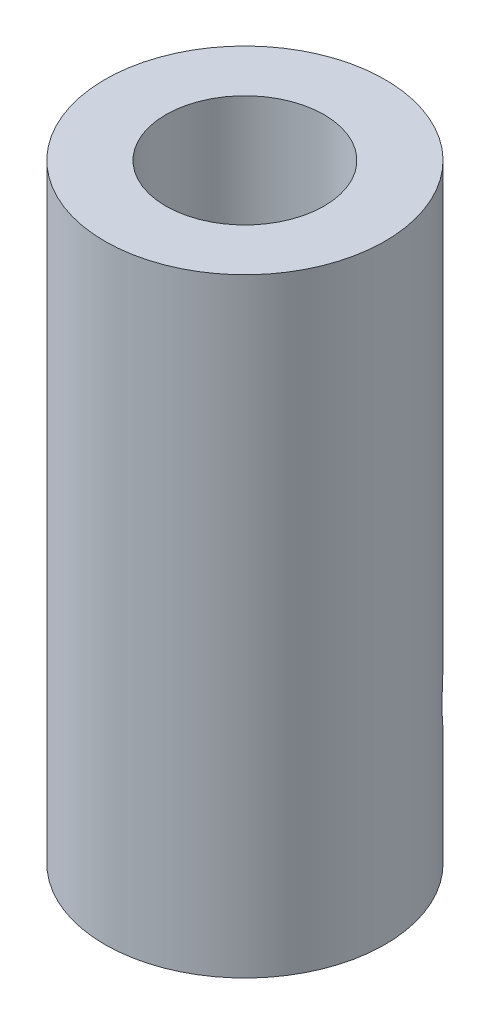
ISO-10303-21;
HEADER;
FILE_DESCRIPTION(('STEP AP214'),'2;1');
FILE_NAME('part.step','',(''),(''),'','','');
FILE_SCHEMA(('AUTOMOTIVE_DESIGN { 1 0 10303 214 1 1 1 1 }'));
ENDSEC;
DATA;
#1=APPLICATION_CONTEXT('core data for automotive mechanical design processes');
#2=APPLICATION_PROTOCOL_DEFINITION('international standard','automotive_design',2000,#1);
#3=PRODUCT_CONTEXT('',#1,'mechanical');
#4=PRODUCT('Part','Part','',(#3));
#5=PRODUCT_RELATED_PRODUCT_CATEGORY('part','',(#4));
#6=PRODUCT_DEFINITION_FORMATION('','',#4);
#7=PRODUCT_DEFINITION_CONTEXT('part definition',#1,'design');
#8=PRODUCT_DEFINITION('design','',#6,#7);
#9=PRODUCT_DEFINITION_SHAPE('','',#8);
#10=(LENGTH_UNIT() NAMED_UNIT(*) SI_UNIT(.MILLI.,.METRE.));
#11=(NAMED_UNIT(*) PLANE_ANGLE_UNIT() SI_UNIT($,.RADIAN.));
#12=(NAMED_UNIT(*) SI_UNIT($,.STERADIAN.) SOLID_ANGLE_UNIT());
#13=UNCERTAINTY_MEASURE_WITH_UNIT(LENGTH_MEASURE(1.E-05),#10,'distance_accuracy_value','');
#14=(GEOMETRIC_REPRESENTATION_CONTEXT(3) GLOBAL_UNCERTAINTY_ASSIGNED_CONTEXT((#13)) GLOBAL_UNIT_ASSIGNED_CONTEXT((#10,
#11,#12)) REPRESENTATION_CONTEXT('',''));
#15=CARTESIAN_POINT('',(0.,0.,0.));
#16=DIRECTION('',(0.,0.,1.));
#17=DIRECTION('',(1.,0.,0.));
#18=AXIS2_PLACEMENT_3D('',#15,#16,#17);
#19=CARTESIAN_POINT('',(0.,20.,0.));
#20=DIRECTION('',(0.,1.,0.));
#21=DIRECTION('',(0.,0.,1.));
#22=AXIS2_PLACEMENT_3D('',#19,#20,#21);
#23=PLANE('',#22);
#24=CARTESIAN_POINT('',(0.,20.,0.));
#25=DIRECTION('',(0.,1.,0.));
#26=DIRECTION('',(0.,0.,1.));
#27=AXIS2_PLACEMENT_3D('',#24,#25,#26);
#28=CIRCLE('',#27,4.6);
#29=CARTESIAN_POINT('',(0.,20.,4.6));
#30=VERTEX_POINT('',#29);
#31=EDGE_CURVE('E10',#30,#30,#28,.T.);
#32=ORIENTED_EDGE('',*,*,#31,.T.);
#33=EDGE_LOOP('',(#32));
#34=FACE_BOUND('',#33,.T.);
#35=CARTESIAN_POINT('',(0.,20.,0.));
#36=DIRECTION('',(0.,1.,0.));
#37=DIRECTION('',(0.,0.,1.));
#38=AXIS2_PLACEMENT_3D('',#35,#36,#37);
#39=CIRCLE('',#38,2.6);
#40=CARTESIAN_POINT('',(0.,20.,2.6));
#41=VERTEX_POINT('',#40);
#42=EDGE_CURVE('E52',#41,#41,#39,.T.);
#43=ORIENTED_EDGE('',*,*,#42,.F.);
#44=EDGE_LOOP('',(#43));
#45=FACE_BOUND('',#44,.T.);
#46=ADVANCED_FACE('F33',(#34,#45),#23,.T.);
#47=CARTESIAN_POINT('',(0.,0.,0.));
#48=DIRECTION('',(0.,1.,0.));
#49=DIRECTION('',(0.,0.,1.));
#50=AXIS2_PLACEMENT_3D('',#47,#48,#49);
#51=PLANE('',#50);
#52=CARTESIAN_POINT('',(0.,0.,0.));
#53=DIRECTION('',(0.,1.,0.));
#54=DIRECTION('',(0.,0.,1.));
#55=AXIS2_PLACEMENT_3D('',#52,#53,#54);
#56=CIRCLE('',#55,4.6);
#57=CARTESIAN_POINT('',(0.,0.,4.6));
#58=VERTEX_POINT('',#57);
#59=EDGE_CURVE('E47',#58,#58,#56,.T.);
#60=ORIENTED_EDGE('',*,*,#59,.F.);
#61=EDGE_LOOP('',(#60));
#62=FACE_BOUND('',#61,.T.);
#63=CARTESIAN_POINT('',(0.,0.,0.));
#64=DIRECTION('',(0.,1.,0.));
#65=DIRECTION('',(0.,0.,1.));
#66=AXIS2_PLACEMENT_3D('',#63,#64,#65);
#67=CIRCLE('',#66,2.6);
#68=CARTESIAN_POINT('',(0.,0.,2.6));
#69=VERTEX_POINT('',#68);
#70=EDGE_CURVE('E54',#69,#69,#67,.T.);
#71=ORIENTED_EDGE('',*,*,#70,.T.);
#72=EDGE_LOOP('',(#71));
#73=FACE_BOUND('',#72,.T.);
#74=ADVANCED_FACE('F75',(#62,#73),#51,.F.);
#75=CARTESIAN_POINT('',(0.,20.,0.));
#76=DIRECTION('',(0.,-1.,0.));
#77=DIRECTION('',(0.,0.,-1.));
#78=AXIS2_PLACEMENT_3D('',#75,#76,#77);
#79=CYLINDRICAL_SURFACE('',#78,4.6);
#80=CARTESIAN_POINT('',(1.21393897443061,4.83148807816108,-4.43693048924122));
#81=CARTESIAN_POINT('',(1.21394002968723,4.75483016626257,-4.43693062641619));
#82=CARTESIAN_POINT('',(1.22034433944287,4.67816423743907,-4.43519297505842));
#83=CARTESIAN_POINT('',(1.24562694290883,4.52707753913675,-4.42815772496298));
#84=CARTESIAN_POINT('',(1.26450912739273,4.45265747752124,-4.4228590158296));
#85=CARTESIAN_POINT('',(1.313769067587,4.30827202547096,-4.40847619299574));
#86=CARTESIAN_POINT('',(1.34412728456921,4.23829929836612,-4.39939851061019));
#87=CARTESIAN_POINT('',(1.41500826468087,4.10442939352495,-4.3771139527922));
#88=CARTESIAN_POINT('',(1.45553264500598,4.040533184651,-4.36390642031603));
#89=CARTESIAN_POINT('',(1.54651333783732,3.91854866221648,-4.33251362144802));
#90=CARTESIAN_POINT('',(1.59722754091337,3.86068749675295,-4.31419291394042));
#91=CARTESIAN_POINT('',(1.70593820541893,3.75444075049606,-4.27237194351496));
#92=CARTESIAN_POINT('',(1.76393562849166,3.70605642314466,-4.24887099631177));
#93=CARTESIAN_POINT('',(1.8865467795071,3.6191449537019,-4.1958895018031));
#94=CARTESIAN_POINT('',(1.95127529289261,3.58085021312157,-4.16629204572812));
#95=CARTESIAN_POINT('',(2.08402605495291,3.51673230088624,-4.10149744346969));
#96=CARTESIAN_POINT('',(2.1520475677291,3.49090635681007,-4.06630154440895));
#97=CARTESIAN_POINT('',(2.28700923699584,3.45321315763524,-3.9919104191008));
#98=CARTESIAN_POINT('',(2.35392242886892,3.44095800451788,-3.95286311474611));
#99=CARTESIAN_POINT('',(2.48645491769769,3.42952687314293,-3.87086663167903));
#100=CARTESIAN_POINT('',(2.55207449102725,3.43034807020577,-3.82791829763813));
#101=CARTESIAN_POINT('',(2.67792626640577,3.44478774405802,-3.7409057957149));
#102=CARTESIAN_POINT('',(2.73826454232281,3.45798601005271,-3.69692430316067));
#103=CARTESIAN_POINT('',(2.85436999193949,3.49611769906917,-3.60803558497175));
#104=CARTESIAN_POINT('',(2.91013687274881,3.52105187332427,-3.56312830025168));
#105=CARTESIAN_POINT('',(3.016583180307,3.58222709898061,-3.47348950920551));
#106=CARTESIAN_POINT('',(3.06719444640625,3.61859870810571,-3.42876640024433));
#107=CARTESIAN_POINT('',(3.16175758366139,3.70151257588428,-3.34176951729847));
#108=CARTESIAN_POINT('',(3.20570783410928,3.74805730307782,-3.29949634095319));
#109=CARTESIAN_POINT('',(3.28800181975485,3.85216801778653,-3.21753828544619));
#110=CARTESIAN_POINT('',(3.32605438682463,3.91009764249747,-3.17802234362499));
#111=CARTESIAN_POINT('',(3.39395433858001,4.03421557971645,-3.10540687394976));
#112=CARTESIAN_POINT('',(3.42380085758125,4.1004047624838,-3.07230802316535));
#113=CARTESIAN_POINT('',(3.47523296092612,4.24007030134573,-3.01401538763567));
#114=CARTESIAN_POINT('',(3.49673186730253,4.31361363872567,-2.98890501187903));
#115=CARTESIAN_POINT('',(3.53076388018486,4.46534758419288,-2.9486284437155));
#116=CARTESIAN_POINT('',(3.5433000126086,4.54353661418507,-2.93345889533507));
#117=CARTESIAN_POINT('',(3.55892998220891,4.69913536940874,-2.9144748636813));
#118=CARTESIAN_POINT('',(3.56236685496871,4.77646037943329,-2.91024799208174));
#119=CARTESIAN_POINT('',(3.56074017031866,4.93087886929535,-2.91223827291779));
#120=CARTESIAN_POINT('',(3.55567784464877,5.00797238106053,-2.91845391198047));
#121=CARTESIAN_POINT('',(3.53738171625563,5.15757893435147,-2.94059947180901));
#122=CARTESIAN_POINT('',(3.52437201566908,5.23015943656759,-2.95626283541564));
#123=CARTESIAN_POINT('',(3.49054045139544,5.37102185380522,-2.99613189990575));
#124=CARTESIAN_POINT('',(3.46971735773164,5.43930309006312,-3.02033894569168));
#125=CARTESIAN_POINT('',(3.41979845150493,5.57170417534313,-3.07675648256163));
#126=CARTESIAN_POINT('',(3.39049103295733,5.63565811101909,-3.10916862483934));
#127=CARTESIAN_POINT('',(3.32414295635136,5.75575771925728,-3.18000384758869));
#128=CARTESIAN_POINT('',(3.28710039261443,5.81190146196179,-3.21842840873144));
#129=CARTESIAN_POINT('',(3.20406621896388,5.91704419901938,-3.30113910239417));
#130=CARTESIAN_POINT('',(3.15778191453324,5.96567910894606,-3.34559540352757));
#131=CARTESIAN_POINT('',(3.05790207919076,6.05169174308203,-3.43712326169692));
#132=CARTESIAN_POINT('',(3.00430690304654,6.08907001324927,-3.48419469176538));
#133=CARTESIAN_POINT('',(2.89120492406707,6.15114786146721,-3.5785909268843));
#134=CARTESIAN_POINT('',(2.83174597457486,6.17594133122149,-3.62591111199831));
#135=CARTESIAN_POINT('',(2.70798202798583,6.21237973909031,-3.71925149095454));
#136=CARTESIAN_POINT('',(2.64367846778528,6.22402855961633,-3.76527206473328));
#137=CARTESIAN_POINT('',(2.5146674631061,6.23354478090128,-3.85256731640784));
#138=CARTESIAN_POINT('',(2.45007675837446,6.23193944260286,-3.89395774564384));
#139=CARTESIAN_POINT('',(2.3200277204816,6.21625838607705,-3.9728143535718));
#140=CARTESIAN_POINT('',(2.25456943923395,6.20218341071209,-4.01028076588331));
#141=CARTESIAN_POINT('',(2.12556305333443,6.1622922603331,-4.08011106081143));
#142=CARTESIAN_POINT('',(2.06200170821529,6.13661094742639,-4.11252795527546));
#143=CARTESIAN_POINT('',(1.93796159199676,6.0743571172054,-4.17241583449616));
#144=CARTESIAN_POINT('',(1.87748333753682,6.03778278150646,-4.19988599225898));
#145=CARTESIAN_POINT('',(1.75956333957812,5.95339678389423,-4.25066996352544));
#146=CARTESIAN_POINT('',(1.70228536672357,5.90525701304315,-4.2738186545445));
#147=CARTESIAN_POINT('',(1.59488754867925,5.79969332026379,-4.31504918527352));
#148=CARTESIAN_POINT('',(1.54476980047317,5.74226668898826,-4.33312954212809));
#149=CARTESIAN_POINT('',(1.45208120995925,5.6176281593425,-4.36508214546354));
#150=CARTESIAN_POINT('',(1.4097918147963,5.55016849653665,-4.37880690049967));
#151=CARTESIAN_POINT('',(1.33656861681746,5.40865031513334,-4.40171155723602));
#152=CARTESIAN_POINT('',(1.30562964965221,5.33459481669452,-4.41089352653013));
#153=CARTESIAN_POINT('',(1.25906005921073,5.18962277054214,-4.42439781287961));
#154=CARTESIAN_POINT('',(1.24220699560507,5.119134158244,-4.42911460550188));
#155=CARTESIAN_POINT('',(1.21964715568424,4.97626183194273,-4.43538053767876));
#156=CARTESIAN_POINT('',(1.21393797791895,4.90387852964345,-4.43693035970263));
#157=CARTESIAN_POINT('',(1.21393897443061,4.83148807816108,-4.43693048924122));
#158=B_SPLINE_CURVE_WITH_KNOTS('',3,(#80,#81,#82,#83,#84,#85,#86,#87,#88,#89,#90,#91,#92,#93,
#94,#95,#96,#97,#98,#99,#100,#101,#102,#103,#104,#105,#106,#107,#108,#109,#110,#111,#112,#113,
#114,#115,#116,#117,#118,#119,#120,#121,#122,#123,#124,#125,#126,#127,#128,#129,#130,#131,#132,
#133,#134,#135,#136,#137,#138,#139,#140,#141,#142,#143,#144,#145,#146,#147,#148,#149,#150,#151,
#152,#153,#154,#155,#156,#157),.UNSPECIFIED.,.T.,.F.,(4,2,2,2,2,2,2,2,2,2,2,2,2,2,2,2,2,2,2,2,2,
2,2,2,2,2,2,2,2,2,2,2,2,2,2,2,2,2,4),(0.,0.229706571746298,0.459484802990526,0.688873570350863,
0.91829885119208,1.15449719566242,1.39072675954213,1.63199776285139,1.87321509512292,
2.10734382790687,2.34142198620595,2.56783009401509,2.79425269652326,3.02335993981614,
3.25252283856671,3.49076636476444,3.72903501445987,3.9697154964298,4.21031468395838,
4.44170502661555,4.67306183809559,4.89817799304372,5.12332960043417,5.35466825513465,
5.58606397125216,5.82648501598972,6.06689439819448,6.30548277064436,6.54400065502917,
6.77307723892421,7.00214017679672,7.2286073087686,7.45511226636476,7.68901771274781,
7.92299152218529,8.16420379962704,8.40530619099566,8.62227201439635,8.83919107761315),.UNSPECIFIED.);
#159=CARTESIAN_POINT('',(1.21393897443061,4.83148807816108,-4.43693048924122));
#160=VERTEX_POINT('',#159);
#161=EDGE_CURVE('E57',#160,#160,#158,.T.);
#162=ORIENTED_EDGE('',*,*,#161,.T.);
#163=EDGE_LOOP('',(#162));
#164=FACE_BOUND('',#163,.T.);
#165=ORIENTED_EDGE('',*,*,#31,.F.);
#166=EDGE_LOOP('',(#165));
#167=FACE_BOUND('',#166,.T.);
#168=ORIENTED_EDGE('',*,*,#59,.T.);
#169=EDGE_LOOP('',(#168));
#170=FACE_BOUND('',#169,.T.);
#171=ADVANCED_FACE('F35',(#164,#167,#170),#79,.T.);
#172=CARTESIAN_POINT('',(0.,20.,0.));
#173=DIRECTION('',(0.,-1.,0.));
#174=DIRECTION('',(0.,0.,-1.));
#175=AXIS2_PLACEMENT_3D('',#172,#173,#174);
#176=CYLINDRICAL_SURFACE('',#175,2.6);
#177=CARTESIAN_POINT('',(0.0200366644704491,4.83148807816108,-2.59992279348386));
#178=CARTESIAN_POINT('',(0.0200453405409458,4.75944905308153,-2.59992605894277));
#179=CARTESIAN_POINT('',(0.0266975526383886,4.68734008009834,-2.59989780228356));
#180=CARTESIAN_POINT('',(0.0527371703430023,4.54540955634089,-2.5994954394624));
#181=CARTESIAN_POINT('',(0.0721472115967338,4.47559230326239,-2.59912071810211));
#182=CARTESIAN_POINT('',(0.122048302765725,4.34057752236651,-2.59725188236622));
#183=CARTESIAN_POINT('',(0.152472759003753,4.27535498742672,-2.59576443911286));
#184=CARTESIAN_POINT('',(0.222654660379751,4.1502734098918,-2.59068708558812));
#185=CARTESIAN_POINT('',(0.26241375818907,4.09041531965209,-2.58709680284664));
#186=CARTESIAN_POINT('',(0.353816688635738,3.97139640806857,-2.57626231069768));
#187=CARTESIAN_POINT('',(0.406237415187998,3.9128610543207,-2.56869874549515));
#188=CARTESIAN_POINT('',(0.518341945148118,3.80418573343735,-2.54844430616129));
#189=CARTESIAN_POINT('',(0.578029876151479,3.75405057618027,-2.53575050860048));
#190=CARTESIAN_POINT('',(0.707858200559269,3.65959158164721,-2.50275305269873));
#191=CARTESIAN_POINT('',(0.778453856877277,3.61607151605218,-2.48191464114842));
#192=CARTESIAN_POINT('',(0.923271832315456,3.54180778166173,-2.43175300161651));
#193=CARTESIAN_POINT('',(0.997491457673234,3.5110547797105,-2.40243599846769));
#194=CARTESIAN_POINT('',(1.1405241240623,3.46579234836831,-2.33770455019227));
#195=CARTESIAN_POINT('',(1.20929224193211,3.4501759964175,-2.30296959244766));
#196=CARTESIAN_POINT('',(1.34468364515292,3.43194924715753,-2.22662279435383));
#197=CARTESIAN_POINT('',(1.4113084406875,3.4293294837968,-2.18501592862706));
#198=CARTESIAN_POINT('',(1.53347449304657,3.43682571543019,-2.10081094599525));
#199=CARTESIAN_POINT('',(1.58945677065099,3.44568850344839,-2.0587324777774));
#200=CARTESIAN_POINT('',(1.69632359332199,3.47360527170719,-1.97160837631166));
#201=CARTESIAN_POINT('',(1.74720774946568,3.49266002876576,-1.92656251712279));
#202=CARTESIAN_POINT('',(1.84355423289978,3.54045235138469,-1.83461138217189));
#203=CARTESIAN_POINT('',(1.88894657278583,3.56930001939865,-1.78769056812779));
#204=CARTESIAN_POINT('',(1.97325301002614,3.63565905945942,-1.69417881290148));
#205=CARTESIAN_POINT('',(2.01216495568457,3.67317329925177,-1.64758798618234));
#206=CARTESIAN_POINT('',(2.08726128879694,3.76029166135819,-1.55159020792602));
#207=CARTESIAN_POINT('',(2.12273132632118,3.81075122140798,-1.50240055742014));
#208=CARTESIAN_POINT('',(2.1860999286534,3.92007775939935,-1.40860841448614));
#209=CARTESIAN_POINT('',(2.21399109182783,3.97895287108548,-1.36401043255118));
#210=CARTESIAN_POINT('',(2.26457700156893,4.10926441192847,-1.27842084377368));
#211=CARTESIAN_POINT('',(2.28665971536183,4.18133451115244,-1.23802303341899));
#212=CARTESIAN_POINT('',(2.32283301885233,4.33266206593119,-1.16875421172628));
#213=CARTESIAN_POINT('',(2.33693274697583,4.41191118229835,-1.13987003156061));
#214=CARTESIAN_POINT('',(2.356602944534,4.56869024332982,-1.09859482673131));
#215=CARTESIAN_POINT('',(2.36277258567656,4.64583804339113,-1.08505583319782));
#216=CARTESIAN_POINT('',(2.36868133356846,4.80152503222205,-1.0721052153044));
#217=CARTESIAN_POINT('',(2.36842699753723,4.88006272042626,-1.07267918524256));
#218=CARTESIAN_POINT('',(2.3619775395549,5.02479937900232,-1.08678349502714));
#219=CARTESIAN_POINT('',(2.35659780327037,5.09121965995843,-1.09853518612654));
#220=CARTESIAN_POINT('',(2.34100821131318,5.22111512679251,-1.1313746174943));
#221=CARTESIAN_POINT('',(2.33079639740668,5.28458910719907,-1.15246614257428));
#222=CARTESIAN_POINT('',(2.3048706965452,5.41000206174812,-1.20350321477482));
#223=CARTESIAN_POINT('',(2.28893579717231,5.47175262796099,-1.23379551574898));
#224=CARTESIAN_POINT('',(2.2514537209094,5.58973430519262,-1.3009358357157));
#225=CARTESIAN_POINT('',(2.2299037068476,5.64596260612106,-1.33778716582382));
#226=CARTESIAN_POINT('',(2.17720091237639,5.76017742208572,-1.42219039924996));
#227=CARTESIAN_POINT('',(2.14509073356826,5.81715352475696,-1.47051800952819));
#228=CARTESIAN_POINT('',(2.07260726158138,5.92174371773222,-1.57103153455348));
#229=CARTESIAN_POINT('',(2.03222966702687,5.96935290922753,-1.62321944867687));
#230=CARTESIAN_POINT('',(1.9410070915417,6.05578115880251,-1.7313890783817));
#231=CARTESIAN_POINT('',(1.88977815000234,6.09411833227457,-1.78743650151916));
#232=CARTESIAN_POINT('',(1.7784502912332,6.15747933185101,-1.89822492462113));
#233=CARTESIAN_POINT('',(1.71836036810935,6.18251654050644,-1.95296718466119));
#234=CARTESIAN_POINT('',(1.59705144573615,6.2161183807624,-2.0530422409351));
#235=CARTESIAN_POINT('',(1.53654399305478,6.22607792457441,-2.09876882412354));
#236=CARTESIAN_POINT('',(1.41121296328184,6.23353362360604,-2.18500625594099));
#237=CARTESIAN_POINT('',(1.34639147070393,6.23103575563505,-2.22551959620742));
#238=CARTESIAN_POINT('',(1.22024123131731,6.21446589180048,-2.29691716581807));
#239=CARTESIAN_POINT('',(1.1590736494046,6.20137915232085,-2.32832329075668));
#240=CARTESIAN_POINT('',(1.03687596971838,6.16547241282013,-2.38525340544526));
#241=CARTESIAN_POINT('',(0.975845889980643,6.14265120306603,-2.41077666350555));
#242=CARTESIAN_POINT('',(0.853453004858387,6.08712142052881,-2.45683788118381));
#243=CARTESIAN_POINT('',(0.792160177988161,6.0540807414787,-2.47715852194948));
#244=CARTESIAN_POINT('',(0.673265345062877,5.9794587501927,-2.51208270721247));
#245=CARTESIAN_POINT('',(0.615664915997655,5.93787382025096,-2.52668382237945));
#246=CARTESIAN_POINT('',(0.499514223927666,5.84199854004254,-2.55233328078569));
#247=CARTESIAN_POINT('',(0.441578063781279,5.78680740882954,-2.56280173115905));
#248=CARTESIAN_POINT('',(0.334133817231243,5.6680333872423,-2.57901420211944));
#249=CARTESIAN_POINT('',(0.284635350645837,5.60444106329274,-2.58475285846487));
#250=CARTESIAN_POINT('',(0.193803017590405,5.46607482733502,-2.59319107322923));
#251=CARTESIAN_POINT('',(0.153104912223382,5.39086749129059,-2.59569620500852));
#252=CARTESIAN_POINT('',(0.0867710193902931,5.2341536108196,-2.59876809634938));
#253=CARTESIAN_POINT('',(0.0610863067112553,5.1526685179271,-2.59934118145009));
#254=CARTESIAN_POINT('',(0.0361773911097393,5.03035160839631,-2.59975878514277));
#255=CARTESIAN_POINT('',(0.0301434095889118,4.99082943222023,-2.59982837579991));
#256=CARTESIAN_POINT('',(0.0220705930024525,4.91137470854267,-2.59990947511874));
#257=CARTESIAN_POINT('',(0.0200318525736311,4.87144215134284,-2.59992098240459));
#258=CARTESIAN_POINT('',(0.0200366644704491,4.83148807816108,-2.59992279348386));
#259=B_SPLINE_CURVE_WITH_KNOTS('',3,(#177,#178,#179,#180,#181,#182,#183,#184,#185,#186,#187,
#188,#189,#190,#191,#192,#193,#194,#195,#196,#197,#198,#199,#200,#201,#202,#203,#204,#205,#206,
#207,#208,#209,#210,#211,#212,#213,#214,#215,#216,#217,#218,#219,#220,#221,#222,#223,#224,#225,
#226,#227,#228,#229,#230,#231,#232,#233,#234,#235,#236,#237,#238,#239,#240,#241,#242,#243,#244,
#245,#246,#247,#248,#249,#250,#251,#252,#253,#254,#255,#256,#257,#258),.UNSPECIFIED.,.T.,.F.,(4,
2,2,2,2,2,2,2,2,2,2,2,2,2,2,2,2,2,2,2,2,2,2,2,2,2,2,2,2,2,2,2,2,2,2,2,2,2,2,2,4),(0.,
0.215947933315909,0.432280051434488,0.647325480893919,0.862409012275168,1.0982615786583,
1.33424873401551,1.58942052151836,1.84440543992388,2.07889562661032,2.31321680228836,
2.52399400592735,2.73478727700682,2.94803364068361,3.16135066834042,3.39704546764996,
3.6329696291582,3.88820059161415,4.14313878770746,4.37739391145692,4.61140993097673,
4.81349329473387,5.01565862444303,5.2266617906453,5.43777177871738,5.68067383635269,
5.92370259380915,6.1774797558553,6.43100107888791,6.65921388994515,6.88731721973611,
7.09634727273712,7.30540331012675,7.52213113648983,7.73895091699454,7.98001719504349,
8.221356500884,8.47661880500891,8.73104456206121,8.85081013570963,8.97057854625691),.UNSPECIFIED.);
#260=CARTESIAN_POINT('',(0.0200366644704491,4.83148807816108,-2.59992279348386));
#261=VERTEX_POINT('',#260);
#262=EDGE_CURVE('E38',#261,#261,#259,.T.);
#263=ORIENTED_EDGE('',*,*,#262,.F.);
#264=EDGE_LOOP('',(#263));
#265=FACE_BOUND('',#264,.T.);
#266=ORIENTED_EDGE('',*,*,#42,.T.);
#267=EDGE_LOOP('',(#266));
#268=FACE_BOUND('',#267,.T.);
#269=ORIENTED_EDGE('',*,*,#70,.F.);
#270=EDGE_LOOP('',(#269));
#271=FACE_BOUND('',#270,.T.);
#272=ADVANCED_FACE('F67',(#265,#268,#271),#176,.F.);
#273=CARTESIAN_POINT('',(-0.272469677759463,4.83148807816108,0.419237730532047));
#274=DIRECTION('',(0.544939355518921,0.,-0.838475461064081));
#275=DIRECTION('',(-0.838475461064081,0.,-0.544939355518921));
#276=AXIS2_PLACEMENT_3D('',#273,#274,#275);
#277=CYLINDRICAL_SURFACE('',#276,1.4);
#278=ORIENTED_EDGE('',*,*,#262,.T.);
#279=EDGE_LOOP('',(#278));
#280=FACE_BOUND('',#279,.T.);
#281=ORIENTED_EDGE('',*,*,#161,.F.);
#282=EDGE_LOOP('',(#281));
#283=FACE_BOUND('',#282,.T.);
#284=ADVANCED_FACE('F64',(#280,#283),#277,.F.);
#285=CLOSED_SHELL('',(#46,#74,#171,#272,#284));
#286=MANIFOLD_SOLID_BREP('B2',#285);
#287=ADVANCED_BREP_SHAPE_REPRESENTATION('',(#18,#286),#14);
#288=SHAPE_DEFINITION_REPRESENTATION(#9,#287);
ENDSEC;
END-ISO-10303-21;
